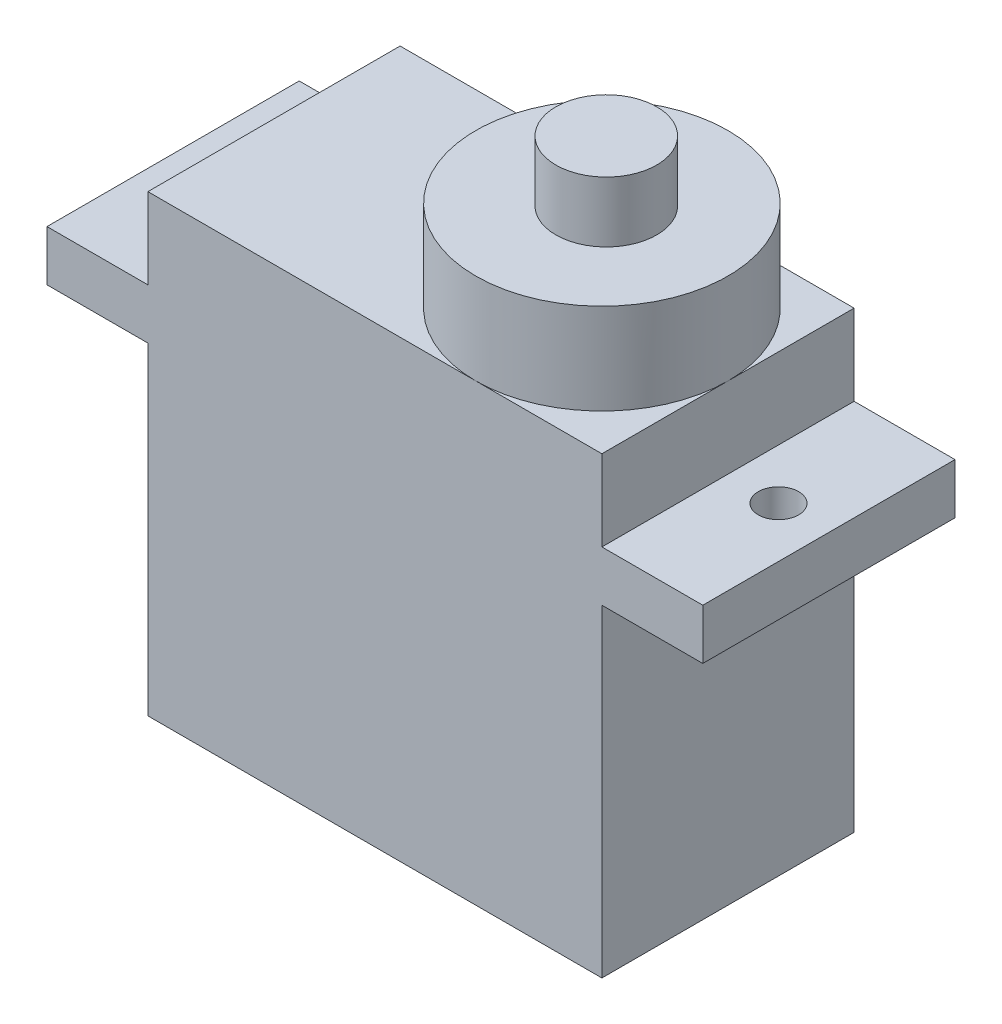
ISO-10303-21;
HEADER;
FILE_DESCRIPTION(('STEP AP214'),'2;1');
FILE_NAME('part.step','',(''),(''),'','','');
FILE_SCHEMA(('AUTOMOTIVE_DESIGN { 1 0 10303 214 1 1 1 1 }'));
ENDSEC;
DATA;
#1=APPLICATION_CONTEXT('core data for automotive mechanical design processes');
#2=APPLICATION_PROTOCOL_DEFINITION('international standard','automotive_design',2000,#1);
#3=PRODUCT_CONTEXT('',#1,'mechanical');
#4=PRODUCT('Part','Part','',(#3));
#5=PRODUCT_RELATED_PRODUCT_CATEGORY('part','',(#4));
#6=PRODUCT_DEFINITION_FORMATION('','',#4);
#7=PRODUCT_DEFINITION_CONTEXT('part definition',#1,'design');
#8=PRODUCT_DEFINITION('design','',#6,#7);
#9=PRODUCT_DEFINITION_SHAPE('','',#8);
#10=(LENGTH_UNIT() NAMED_UNIT(*) SI_UNIT(.MILLI.,.METRE.));
#11=(NAMED_UNIT(*) PLANE_ANGLE_UNIT() SI_UNIT($,.RADIAN.));
#12=(NAMED_UNIT(*) SI_UNIT($,.STERADIAN.) SOLID_ANGLE_UNIT());
#13=UNCERTAINTY_MEASURE_WITH_UNIT(LENGTH_MEASURE(1.E-05),#10,'distance_accuracy_value','');
#14=(GEOMETRIC_REPRESENTATION_CONTEXT(3) GLOBAL_UNCERTAINTY_ASSIGNED_CONTEXT((#13)) GLOBAL_UNIT_ASSIGNED_CONTEXT((#10,
#11,#12)) REPRESENTATION_CONTEXT('',''));
#15=CARTESIAN_POINT('',(0.,0.,0.));
#16=DIRECTION('',(0.,0.,1.));
#17=DIRECTION('',(1.,0.,0.));
#18=AXIS2_PLACEMENT_3D('',#15,#16,#17);
#19=CARTESIAN_POINT('',(0.,22.5,0.));
#20=DIRECTION('',(0.,1.,0.));
#21=DIRECTION('',(0.,0.,1.));
#22=AXIS2_PLACEMENT_3D('',#19,#20,#21);
#23=PLANE('',#22);
#24=CARTESIAN_POINT('',(5.,22.5,0.));
#25=DIRECTION('',(0.,1.,0.));
#26=DIRECTION('',(0.,0.,1.));
#27=AXIS2_PLACEMENT_3D('',#24,#25,#26);
#28=CIRCLE('',#27,6.25);
#29=CARTESIAN_POINT('',(5.,22.5,6.25));
#30=VERTEX_POINT('',#29);
#31=CARTESIAN_POINT('',(11.25,22.5,0.));
#32=VERTEX_POINT('',#31);
#33=EDGE_CURVE('E159',#30,#32,#28,.T.);
#34=ORIENTED_EDGE('',*,*,#33,.F.);
#35=DIRECTION('',(1.,0.,0.));
#36=VECTOR('',#35,1.);
#37=CARTESIAN_POINT('',(-11.25,22.5,6.25));
#38=LINE('',#37,#36);
#39=CARTESIAN_POINT('',(11.25,22.5,6.25));
#40=VERTEX_POINT('',#39);
#41=EDGE_CURVE('E146',#30,#40,#38,.T.);
#42=ORIENTED_EDGE('',*,*,#41,.T.);
#43=DIRECTION('',(0.,0.,-1.));
#44=VECTOR('',#43,1.);
#45=CARTESIAN_POINT('',(11.25,22.5,-6.25));
#46=LINE('',#45,#44);
#47=EDGE_CURVE('E160',#40,#32,#46,.T.);
#48=ORIENTED_EDGE('',*,*,#47,.T.);
#49=EDGE_LOOP('',(#34,#42,#48));
#50=FACE_BOUND('',#49,.T.);
#51=ADVANCED_FACE('F39',(#50),#23,.T.);
#52=CARTESIAN_POINT('',(5.,22.5,-6.25));
#53=VERTEX_POINT('',#52);
#54=EDGE_CURVE('E48',#32,#53,#28,.T.);
#55=ORIENTED_EDGE('',*,*,#54,.F.);
#56=CARTESIAN_POINT('',(11.25,22.5,-6.25));
#57=VERTEX_POINT('',#56);
#58=EDGE_CURVE('E236',#32,#57,#46,.T.);
#59=ORIENTED_EDGE('',*,*,#58,.T.);
#60=DIRECTION('',(-1.,0.,0.));
#61=VECTOR('',#60,1.);
#62=CARTESIAN_POINT('',(-11.25,22.5,-6.25));
#63=LINE('',#62,#61);
#64=EDGE_CURVE('E237',#57,#53,#63,.T.);
#65=ORIENTED_EDGE('',*,*,#64,.T.);
#66=EDGE_LOOP('',(#55,#59,#65));
#67=FACE_BOUND('',#66,.T.);
#68=ADVANCED_FACE('F296',(#67),#23,.T.);
#69=CARTESIAN_POINT('',(-11.25,22.5,-6.25));
#70=DIRECTION('',(1.,0.,0.));
#71=DIRECTION('',(0.,0.,-1.));
#72=AXIS2_PLACEMENT_3D('',#69,#70,#71);
#73=PLANE('',#72);
#74=DIRECTION('',(0.,0.,1.));
#75=VECTOR('',#74,1.);
#76=CARTESIAN_POINT('',(-11.25,16.,-6.25));
#77=LINE('',#76,#75);
#78=CARTESIAN_POINT('',(-11.25,16.,-6.25));
#79=VERTEX_POINT('',#78);
#80=CARTESIAN_POINT('',(-11.25,16.,6.25));
#81=VERTEX_POINT('',#80);
#82=EDGE_CURVE('E173',#79,#81,#77,.T.);
#83=ORIENTED_EDGE('',*,*,#82,.F.);
#84=DIRECTION('',(0.,-1.,0.));
#85=VECTOR('',#84,1.);
#86=CARTESIAN_POINT('',(-11.25,22.5,-6.25));
#87=LINE('',#86,#85);
#88=CARTESIAN_POINT('',(-11.25,0.,-6.25));
#89=VERTEX_POINT('',#88);
#90=EDGE_CURVE('E253',#79,#89,#87,.T.);
#91=ORIENTED_EDGE('',*,*,#90,.T.);
#92=DIRECTION('',(0.,0.,1.));
#93=VECTOR('',#92,1.);
#94=CARTESIAN_POINT('',(-11.25,0.,-6.25));
#95=LINE('',#94,#93);
#96=CARTESIAN_POINT('',(-11.25,0.,6.25));
#97=VERTEX_POINT('',#96);
#98=EDGE_CURVE('E245',#89,#97,#95,.T.);
#99=ORIENTED_EDGE('',*,*,#98,.T.);
#100=DIRECTION('',(0.,-1.,0.));
#101=VECTOR('',#100,1.);
#102=CARTESIAN_POINT('',(-11.25,22.5,6.25));
#103=LINE('',#102,#101);
#104=EDGE_CURVE('E251',#81,#97,#103,.T.);
#105=ORIENTED_EDGE('',*,*,#104,.F.);
#106=EDGE_LOOP('',(#83,#91,#99,#105));
#107=FACE_BOUND('',#106,.T.);
#108=ADVANCED_FACE('F261',(#107),#73,.F.);
#109=CARTESIAN_POINT('',(11.25,22.5,-6.25));
#110=DIRECTION('',(-1.,0.,0.));
#111=DIRECTION('',(0.,0.,1.));
#112=AXIS2_PLACEMENT_3D('',#109,#110,#111);
#113=PLANE('',#112);
#114=DIRECTION('',(0.,0.,1.));
#115=VECTOR('',#114,1.);
#116=CARTESIAN_POINT('',(11.25,18.5,-6.25));
#117=LINE('',#116,#115);
#118=CARTESIAN_POINT('',(11.25,18.5,-6.25));
#119=VERTEX_POINT('',#118);
#120=CARTESIAN_POINT('',(11.25,18.5,6.25));
#121=VERTEX_POINT('',#120);
#122=EDGE_CURVE('E225',#119,#121,#117,.T.);
#123=ORIENTED_EDGE('',*,*,#122,.F.);
#124=DIRECTION('',(0.,-1.,0.));
#125=VECTOR('',#124,1.);
#126=CARTESIAN_POINT('',(11.25,22.5,-6.25));
#127=LINE('',#126,#125);
#128=EDGE_CURVE('E43',#57,#119,#127,.T.);
#129=ORIENTED_EDGE('',*,*,#128,.F.);
#130=ORIENTED_EDGE('',*,*,#58,.F.);
#131=ORIENTED_EDGE('',*,*,#47,.F.);
#132=DIRECTION('',(0.,-1.,0.));
#133=VECTOR('',#132,1.);
#134=CARTESIAN_POINT('',(11.25,22.5,6.25));
#135=LINE('',#134,#133);
#136=EDGE_CURVE('E154',#40,#121,#135,.T.);
#137=ORIENTED_EDGE('',*,*,#136,.T.);
#138=EDGE_LOOP('',(#123,#129,#130,#131,#137));
#139=FACE_BOUND('',#138,.T.);
#140=ADVANCED_FACE('F295',(#139),#113,.F.);
#141=CARTESIAN_POINT('',(11.25,16.,-6.25));
#142=VERTEX_POINT('',#141);
#143=CARTESIAN_POINT('',(11.25,0.,-6.25));
#144=VERTEX_POINT('',#143);
#145=EDGE_CURVE('E167',#142,#144,#127,.T.);
#146=ORIENTED_EDGE('',*,*,#145,.F.);
#147=DIRECTION('',(0.,0.,1.));
#148=VECTOR('',#147,1.);
#149=CARTESIAN_POINT('',(11.25,16.,-6.25));
#150=LINE('',#149,#148);
#151=CARTESIAN_POINT('',(11.25,16.,6.25));
#152=VERTEX_POINT('',#151);
#153=EDGE_CURVE('E218',#142,#152,#150,.T.);
#154=ORIENTED_EDGE('',*,*,#153,.T.);
#155=CARTESIAN_POINT('',(11.25,0.,6.25));
#156=VERTEX_POINT('',#155);
#157=EDGE_CURVE('E145',#152,#156,#135,.T.);
#158=ORIENTED_EDGE('',*,*,#157,.T.);
#159=DIRECTION('',(0.,0.,-1.));
#160=VECTOR('',#159,1.);
#161=CARTESIAN_POINT('',(11.25,0.,-6.25));
#162=LINE('',#161,#160);
#163=EDGE_CURVE('E227',#156,#144,#162,.T.);
#164=ORIENTED_EDGE('',*,*,#163,.T.);
#165=EDGE_LOOP('',(#146,#154,#158,#164));
#166=FACE_BOUND('',#165,.T.);
#167=ADVANCED_FACE('F41',(#166),#113,.F.);
#168=CARTESIAN_POINT('',(-11.25,22.5,-6.25));
#169=DIRECTION('',(0.,0.,1.));
#170=DIRECTION('',(1.,0.,0.));
#171=AXIS2_PLACEMENT_3D('',#168,#169,#170);
#172=PLANE('',#171);
#173=DIRECTION('',(-1.,0.,0.));
#174=VECTOR('',#173,1.);
#175=CARTESIAN_POINT('',(-11.25,0.,-6.25));
#176=LINE('',#175,#174);
#177=EDGE_CURVE('E242',#144,#89,#176,.T.);
#178=ORIENTED_EDGE('',*,*,#177,.T.);
#179=ORIENTED_EDGE('',*,*,#90,.F.);
#180=DIRECTION('',(1.,0.,0.));
#181=VECTOR('',#180,1.);
#182=CARTESIAN_POINT('',(-11.25,16.,-6.25));
#183=LINE('',#182,#181);
#184=CARTESIAN_POINT('',(-16.25,16.,-6.25));
#185=VERTEX_POINT('',#184);
#186=EDGE_CURVE('E186',#185,#79,#183,.T.);
#187=ORIENTED_EDGE('',*,*,#186,.F.);
#188=DIRECTION('',(0.,-1.,0.));
#189=VECTOR('',#188,1.);
#190=CARTESIAN_POINT('',(-16.25,18.5,-6.25));
#191=LINE('',#190,#189);
#192=CARTESIAN_POINT('',(-16.25,18.5,-6.25));
#193=VERTEX_POINT('',#192);
#194=EDGE_CURVE('E204',#193,#185,#191,.T.);
#195=ORIENTED_EDGE('',*,*,#194,.F.);
#196=DIRECTION('',(-1.,0.,0.));
#197=VECTOR('',#196,1.);
#198=CARTESIAN_POINT('',(-11.25,18.5,-6.25));
#199=LINE('',#198,#197);
#200=CARTESIAN_POINT('',(-11.25,18.5,-6.25));
#201=VERTEX_POINT('',#200);
#202=EDGE_CURVE('E196',#201,#193,#199,.T.);
#203=ORIENTED_EDGE('',*,*,#202,.F.);
#204=CARTESIAN_POINT('',(-11.25,22.5,-6.25));
#205=VERTEX_POINT('',#204);
#206=EDGE_CURVE('E254',#205,#201,#87,.T.);
#207=ORIENTED_EDGE('',*,*,#206,.F.);
#208=EDGE_CURVE('E235',#53,#205,#63,.T.);
#209=ORIENTED_EDGE('',*,*,#208,.F.);
#210=ORIENTED_EDGE('',*,*,#64,.F.);
#211=ORIENTED_EDGE('',*,*,#128,.T.);
#212=DIRECTION('',(-1.,0.,0.));
#213=VECTOR('',#212,1.);
#214=CARTESIAN_POINT('',(11.25,18.5,-6.25));
#215=LINE('',#214,#213);
#216=CARTESIAN_POINT('',(16.25,18.5,-6.25));
#217=VERTEX_POINT('',#216);
#218=EDGE_CURVE('E216',#217,#119,#215,.T.);
#219=ORIENTED_EDGE('',*,*,#218,.F.);
#220=DIRECTION('',(0.,1.,0.));
#221=VECTOR('',#220,1.);
#222=CARTESIAN_POINT('',(16.25,18.5,-6.25));
#223=LINE('',#222,#221);
#224=CARTESIAN_POINT('',(16.25,16.,-6.25));
#225=VERTEX_POINT('',#224);
#226=EDGE_CURVE('E212',#225,#217,#223,.T.);
#227=ORIENTED_EDGE('',*,*,#226,.F.);
#228=DIRECTION('',(1.,0.,0.));
#229=VECTOR('',#228,1.);
#230=CARTESIAN_POINT('',(11.25,16.,-6.25));
#231=LINE('',#230,#229);
#232=EDGE_CURVE('E209',#142,#225,#231,.T.);
#233=ORIENTED_EDGE('',*,*,#232,.F.);
#234=ORIENTED_EDGE('',*,*,#145,.T.);
#235=EDGE_LOOP('',(#178,#179,#187,#195,#203,#207,#209,#210,#211,#219,#227,#233,#234));
#236=FACE_BOUND('',#235,.T.);
#237=ADVANCED_FACE('F268',(#236),#172,.F.);
#238=ORIENTED_EDGE('',*,*,#206,.T.);
#239=DIRECTION('',(0.,0.,1.));
#240=VECTOR('',#239,1.);
#241=CARTESIAN_POINT('',(-11.25,18.5,-6.25));
#242=LINE('',#241,#240);
#243=CARTESIAN_POINT('',(-11.25,18.5,6.25));
#244=VERTEX_POINT('',#243);
#245=EDGE_CURVE('E183',#201,#244,#242,.T.);
#246=ORIENTED_EDGE('',*,*,#245,.T.);
#247=CARTESIAN_POINT('',(-11.25,22.5,6.25));
#248=VERTEX_POINT('',#247);
#249=EDGE_CURVE('E252',#248,#244,#103,.T.);
#250=ORIENTED_EDGE('',*,*,#249,.F.);
#251=DIRECTION('',(0.,0.,1.));
#252=VECTOR('',#251,1.);
#253=CARTESIAN_POINT('',(-11.25,22.5,-6.25));
#254=LINE('',#253,#252);
#255=EDGE_CURVE('E141',#205,#248,#254,.T.);
#256=ORIENTED_EDGE('',*,*,#255,.F.);
#257=EDGE_LOOP('',(#238,#246,#250,#256));
#258=FACE_BOUND('',#257,.T.);
#259=ADVANCED_FACE('F284',(#258),#73,.F.);
#260=CARTESIAN_POINT('',(-11.25,22.5,6.25));
#261=DIRECTION('',(0.,0.,-1.));
#262=DIRECTION('',(-1.,0.,0.));
#263=AXIS2_PLACEMENT_3D('',#260,#261,#262);
#264=PLANE('',#263);
#265=DIRECTION('',(1.,0.,0.));
#266=VECTOR('',#265,1.);
#267=CARTESIAN_POINT('',(-11.25,0.,6.25));
#268=LINE('',#267,#266);
#269=EDGE_CURVE('E248',#97,#156,#268,.T.);
#270=ORIENTED_EDGE('',*,*,#269,.T.);
#271=ORIENTED_EDGE('',*,*,#157,.F.);
#272=DIRECTION('',(1.,0.,0.));
#273=VECTOR('',#272,1.);
#274=CARTESIAN_POINT('',(11.25,16.,6.25));
#275=LINE('',#274,#273);
#276=CARTESIAN_POINT('',(16.25,16.,6.25));
#277=VERTEX_POINT('',#276);
#278=EDGE_CURVE('E202',#152,#277,#275,.T.);
#279=ORIENTED_EDGE('',*,*,#278,.T.);
#280=DIRECTION('',(0.,1.,0.));
#281=VECTOR('',#280,1.);
#282=CARTESIAN_POINT('',(16.25,18.5,6.25));
#283=LINE('',#282,#281);
#284=CARTESIAN_POINT('',(16.25,18.5,6.25));
#285=VERTEX_POINT('',#284);
#286=EDGE_CURVE('E221',#277,#285,#283,.T.);
#287=ORIENTED_EDGE('',*,*,#286,.T.);
#288=DIRECTION('',(-1.,0.,0.));
#289=VECTOR('',#288,1.);
#290=CARTESIAN_POINT('',(11.25,18.5,6.25));
#291=LINE('',#290,#289);
#292=EDGE_CURVE('E213',#285,#121,#291,.T.);
#293=ORIENTED_EDGE('',*,*,#292,.T.);
#294=ORIENTED_EDGE('',*,*,#136,.F.);
#295=ORIENTED_EDGE('',*,*,#41,.F.);
#296=EDGE_CURVE('E137',#248,#30,#38,.T.);
#297=ORIENTED_EDGE('',*,*,#296,.F.);
#298=ORIENTED_EDGE('',*,*,#249,.T.);
#299=DIRECTION('',(-1.,0.,0.));
#300=VECTOR('',#299,1.);
#301=CARTESIAN_POINT('',(-11.25,18.5,6.25));
#302=LINE('',#301,#300);
#303=CARTESIAN_POINT('',(-16.25,18.5,6.25));
#304=VERTEX_POINT('',#303);
#305=EDGE_CURVE('E199',#244,#304,#302,.T.);
#306=ORIENTED_EDGE('',*,*,#305,.T.);
#307=DIRECTION('',(0.,-1.,0.));
#308=VECTOR('',#307,1.);
#309=CARTESIAN_POINT('',(-16.25,18.5,6.25));
#310=LINE('',#309,#308);
#311=CARTESIAN_POINT('',(-16.25,16.,6.25));
#312=VERTEX_POINT('',#311);
#313=EDGE_CURVE('E195',#304,#312,#310,.T.);
#314=ORIENTED_EDGE('',*,*,#313,.T.);
#315=DIRECTION('',(1.,0.,0.));
#316=VECTOR('',#315,1.);
#317=CARTESIAN_POINT('',(-11.25,16.,6.25));
#318=LINE('',#317,#316);
#319=EDGE_CURVE('E192',#312,#81,#318,.T.);
#320=ORIENTED_EDGE('',*,*,#319,.T.);
#321=ORIENTED_EDGE('',*,*,#104,.T.);
#322=EDGE_LOOP('',(#270,#271,#279,#287,#293,#294,#295,#297,#298,#306,#314,#320,#321));
#323=FACE_BOUND('',#322,.T.);
#324=ADVANCED_FACE('F151',(#323),#264,.F.);
#325=EDGE_CURVE('E56',#53,#30,#28,.T.);
#326=ORIENTED_EDGE('',*,*,#325,.F.);
#327=ORIENTED_EDGE('',*,*,#208,.T.);
#328=ORIENTED_EDGE('',*,*,#255,.T.);
#329=ORIENTED_EDGE('',*,*,#296,.T.);
#330=EDGE_LOOP('',(#326,#327,#328,#329));
#331=FACE_BOUND('',#330,.T.);
#332=ADVANCED_FACE('F139',(#331),#23,.T.);
#333=CARTESIAN_POINT('',(0.,0.,0.));
#334=DIRECTION('',(0.,1.,0.));
#335=DIRECTION('',(0.,0.,1.));
#336=AXIS2_PLACEMENT_3D('',#333,#334,#335);
#337=PLANE('',#336);
#338=ORIENTED_EDGE('',*,*,#163,.F.);
#339=ORIENTED_EDGE('',*,*,#269,.F.);
#340=ORIENTED_EDGE('',*,*,#98,.F.);
#341=ORIENTED_EDGE('',*,*,#177,.F.);
#342=EDGE_LOOP('',(#338,#339,#340,#341));
#343=FACE_BOUND('',#342,.T.);
#344=ADVANCED_FACE('F273',(#343),#337,.F.);
#345=CARTESIAN_POINT('',(11.25,18.5,-6.25));
#346=DIRECTION('',(0.,1.,0.));
#347=DIRECTION('',(0.,0.,1.));
#348=AXIS2_PLACEMENT_3D('',#345,#346,#347);
#349=PLANE('',#348);
#350=CARTESIAN_POINT('',(13.75,18.5,0.));
#351=DIRECTION('',(0.,1.,0.));
#352=DIRECTION('',(0.,0.,1.));
#353=AXIS2_PLACEMENT_3D('',#350,#351,#352);
#354=CIRCLE('',#353,1.);
#355=CARTESIAN_POINT('',(13.75,18.5,1.));
#356=VERTEX_POINT('',#355);
#357=EDGE_CURVE('E170',#356,#356,#354,.T.);
#358=ORIENTED_EDGE('',*,*,#357,.F.);
#359=EDGE_LOOP('',(#358));
#360=FACE_BOUND('',#359,.T.);
#361=ORIENTED_EDGE('',*,*,#292,.F.);
#362=DIRECTION('',(0.,0.,1.));
#363=VECTOR('',#362,1.);
#364=CARTESIAN_POINT('',(16.25,18.5,-6.25));
#365=LINE('',#364,#363);
#366=EDGE_CURVE('E228',#217,#285,#365,.T.);
#367=ORIENTED_EDGE('',*,*,#366,.F.);
#368=ORIENTED_EDGE('',*,*,#218,.T.);
#369=ORIENTED_EDGE('',*,*,#122,.T.);
#370=EDGE_LOOP('',(#361,#367,#368,#369));
#371=FACE_BOUND('',#370,.T.);
#372=ADVANCED_FACE('F310',(#360,#371),#349,.T.);
#373=CARTESIAN_POINT('',(16.25,18.5,-6.25));
#374=DIRECTION('',(1.,0.,0.));
#375=DIRECTION('',(0.,0.,-1.));
#376=AXIS2_PLACEMENT_3D('',#373,#374,#375);
#377=PLANE('',#376);
#378=ORIENTED_EDGE('',*,*,#286,.F.);
#379=DIRECTION('',(0.,0.,1.));
#380=VECTOR('',#379,1.);
#381=CARTESIAN_POINT('',(16.25,16.,-6.25));
#382=LINE('',#381,#380);
#383=EDGE_CURVE('E230',#225,#277,#382,.T.);
#384=ORIENTED_EDGE('',*,*,#383,.F.);
#385=ORIENTED_EDGE('',*,*,#226,.T.);
#386=ORIENTED_EDGE('',*,*,#366,.T.);
#387=EDGE_LOOP('',(#378,#384,#385,#386));
#388=FACE_BOUND('',#387,.T.);
#389=ADVANCED_FACE('F314',(#388),#377,.T.);
#390=CARTESIAN_POINT('',(11.25,16.,-6.25));
#391=DIRECTION('',(0.,-1.,0.));
#392=DIRECTION('',(0.,0.,-1.));
#393=AXIS2_PLACEMENT_3D('',#390,#391,#392);
#394=PLANE('',#393);
#395=CARTESIAN_POINT('',(13.75,16.,0.));
#396=DIRECTION('',(0.,-1.,0.));
#397=DIRECTION('',(0.,0.,-1.));
#398=AXIS2_PLACEMENT_3D('',#395,#396,#397);
#399=CIRCLE('',#398,1.);
#400=CARTESIAN_POINT('',(13.75,16.,-1.));
#401=VERTEX_POINT('',#400);
#402=EDGE_CURVE('E174',#401,#401,#399,.F.);
#403=ORIENTED_EDGE('',*,*,#402,.T.);
#404=EDGE_LOOP('',(#403));
#405=FACE_BOUND('',#404,.T.);
#406=ORIENTED_EDGE('',*,*,#278,.F.);
#407=ORIENTED_EDGE('',*,*,#153,.F.);
#408=ORIENTED_EDGE('',*,*,#232,.T.);
#409=ORIENTED_EDGE('',*,*,#383,.T.);
#410=EDGE_LOOP('',(#406,#407,#408,#409));
#411=FACE_BOUND('',#410,.T.);
#412=ADVANCED_FACE('F321',(#405,#411),#394,.T.);
#413=CARTESIAN_POINT('',(-11.25,16.,-6.25));
#414=DIRECTION('',(0.,-1.,0.));
#415=DIRECTION('',(0.,0.,-1.));
#416=AXIS2_PLACEMENT_3D('',#413,#414,#415);
#417=PLANE('',#416);
#418=CARTESIAN_POINT('',(-13.75,16.,0.));
#419=DIRECTION('',(0.,-1.,0.));
#420=DIRECTION('',(0.,0.,-1.));
#421=AXIS2_PLACEMENT_3D('',#418,#419,#420);
#422=CIRCLE('',#421,1.);
#423=CARTESIAN_POINT('',(-13.75,16.,-1.));
#424=VERTEX_POINT('',#423);
#425=EDGE_CURVE('E177',#424,#424,#422,.F.);
#426=ORIENTED_EDGE('',*,*,#425,.T.);
#427=EDGE_LOOP('',(#426));
#428=FACE_BOUND('',#427,.T.);
#429=ORIENTED_EDGE('',*,*,#319,.F.);
#430=DIRECTION('',(0.,0.,1.));
#431=VECTOR('',#430,1.);
#432=CARTESIAN_POINT('',(-16.25,16.,-6.25));
#433=LINE('',#432,#431);
#434=EDGE_CURVE('E189',#185,#312,#433,.T.);
#435=ORIENTED_EDGE('',*,*,#434,.F.);
#436=ORIENTED_EDGE('',*,*,#186,.T.);
#437=ORIENTED_EDGE('',*,*,#82,.T.);
#438=EDGE_LOOP('',(#429,#435,#436,#437));
#439=FACE_BOUND('',#438,.T.);
#440=ADVANCED_FACE('F278',(#428,#439),#417,.T.);
#441=CARTESIAN_POINT('',(-16.25,18.5,-6.25));
#442=DIRECTION('',(-1.,0.,0.));
#443=DIRECTION('',(0.,0.,1.));
#444=AXIS2_PLACEMENT_3D('',#441,#442,#443);
#445=PLANE('',#444);
#446=ORIENTED_EDGE('',*,*,#313,.F.);
#447=DIRECTION('',(0.,0.,1.));
#448=VECTOR('',#447,1.);
#449=CARTESIAN_POINT('',(-16.25,18.5,-6.25));
#450=LINE('',#449,#448);
#451=EDGE_CURVE('E187',#193,#304,#450,.T.);
#452=ORIENTED_EDGE('',*,*,#451,.F.);
#453=ORIENTED_EDGE('',*,*,#194,.T.);
#454=ORIENTED_EDGE('',*,*,#434,.T.);
#455=EDGE_LOOP('',(#446,#452,#453,#454));
#456=FACE_BOUND('',#455,.T.);
#457=ADVANCED_FACE('F332',(#456),#445,.T.);
#458=CARTESIAN_POINT('',(-11.25,18.5,-6.25));
#459=DIRECTION('',(0.,1.,0.));
#460=DIRECTION('',(0.,0.,1.));
#461=AXIS2_PLACEMENT_3D('',#458,#459,#460);
#462=PLANE('',#461);
#463=CARTESIAN_POINT('',(-13.75,18.5,0.));
#464=DIRECTION('',(0.,1.,0.));
#465=DIRECTION('',(0.,0.,1.));
#466=AXIS2_PLACEMENT_3D('',#463,#464,#465);
#467=CIRCLE('',#466,1.);
#468=CARTESIAN_POINT('',(-13.75,18.5,1.));
#469=VERTEX_POINT('',#468);
#470=EDGE_CURVE('E180',#469,#469,#467,.T.);
#471=ORIENTED_EDGE('',*,*,#470,.F.);
#472=EDGE_LOOP('',(#471));
#473=FACE_BOUND('',#472,.T.);
#474=ORIENTED_EDGE('',*,*,#305,.F.);
#475=ORIENTED_EDGE('',*,*,#245,.F.);
#476=ORIENTED_EDGE('',*,*,#202,.T.);
#477=ORIENTED_EDGE('',*,*,#451,.T.);
#478=EDGE_LOOP('',(#474,#475,#476,#477));
#479=FACE_BOUND('',#478,.T.);
#480=ADVANCED_FACE('F283',(#473,#479),#462,.T.);
#481=CARTESIAN_POINT('',(-13.75,-0.001000000000001,0.));
#482=DIRECTION('',(0.,1.,0.));
#483=DIRECTION('',(0.,0.,1.));
#484=AXIS2_PLACEMENT_3D('',#481,#482,#483);
#485=CYLINDRICAL_SURFACE('',#484,1.);
#486=ORIENTED_EDGE('',*,*,#425,.F.);
#487=EDGE_LOOP('',(#486));
#488=FACE_BOUND('',#487,.T.);
#489=ORIENTED_EDGE('',*,*,#470,.T.);
#490=EDGE_LOOP('',(#489));
#491=FACE_BOUND('',#490,.T.);
#492=ADVANCED_FACE('F402',(#488,#491),#485,.F.);
#493=CARTESIAN_POINT('',(13.75,-0.001000000000001,0.));
#494=DIRECTION('',(0.,1.,0.));
#495=DIRECTION('',(0.,0.,1.));
#496=AXIS2_PLACEMENT_3D('',#493,#494,#495);
#497=CYLINDRICAL_SURFACE('',#496,1.);
#498=ORIENTED_EDGE('',*,*,#402,.F.);
#499=EDGE_LOOP('',(#498));
#500=FACE_BOUND('',#499,.T.);
#501=ORIENTED_EDGE('',*,*,#357,.T.);
#502=EDGE_LOOP('',(#501));
#503=FACE_BOUND('',#502,.T.);
#504=ADVANCED_FACE('F412',(#500,#503),#497,.F.);
#505=CARTESIAN_POINT('',(5.,27.,0.));
#506=DIRECTION('',(0.,-1.,0.));
#507=DIRECTION('',(0.,0.,-1.));
#508=AXIS2_PLACEMENT_3D('',#505,#506,#507);
#509=CYLINDRICAL_SURFACE('',#508,6.25);
#510=CARTESIAN_POINT('',(5.,27.,0.));
#511=DIRECTION('',(0.,1.,0.));
#512=DIRECTION('',(0.,0.,1.));
#513=AXIS2_PLACEMENT_3D('',#510,#511,#512);
#514=CIRCLE('',#513,6.25);
#515=CARTESIAN_POINT('',(5.,27.,6.25));
#516=VERTEX_POINT('',#515);
#517=EDGE_CURVE('E162',#516,#516,#514,.T.);
#518=ORIENTED_EDGE('',*,*,#517,.F.);
#519=EDGE_LOOP('',(#518));
#520=FACE_BOUND('',#519,.T.);
#521=ORIENTED_EDGE('',*,*,#33,.T.);
#522=ORIENTED_EDGE('',*,*,#54,.T.);
#523=ORIENTED_EDGE('',*,*,#325,.T.);
#524=EDGE_LOOP('',(#521,#522,#523));
#525=FACE_BOUND('',#524,.T.);
#526=ADVANCED_FACE('F165',(#520,#525),#509,.T.);
#527=CARTESIAN_POINT('',(5.,27.,0.));
#528=DIRECTION('',(0.,1.,0.));
#529=DIRECTION('',(0.,0.,1.));
#530=AXIS2_PLACEMENT_3D('',#527,#528,#529);
#531=PLANE('',#530);
#532=CARTESIAN_POINT('',(5.21837814719962,27.,0.));
#533=DIRECTION('',(0.,1.,0.));
#534=DIRECTION('',(0.,0.,1.));
#535=AXIS2_PLACEMENT_3D('',#532,#533,#534);
#536=CIRCLE('',#535,2.5);
#537=CARTESIAN_POINT('',(5.21837814719962,27.,2.5));
#538=VERTEX_POINT('',#537);
#539=EDGE_CURVE('E11',#538,#538,#536,.T.);
#540=ORIENTED_EDGE('',*,*,#539,.F.);
#541=EDGE_LOOP('',(#540));
#542=FACE_BOUND('',#541,.T.);
#543=ORIENTED_EDGE('',*,*,#517,.T.);
#544=EDGE_LOOP('',(#543));
#545=FACE_BOUND('',#544,.T.);
#546=ADVANCED_FACE('F437',(#542,#545),#531,.T.);
#547=CARTESIAN_POINT('',(5.21837814719962,30.,0.));
#548=DIRECTION('',(0.,-1.,0.));
#549=DIRECTION('',(0.,0.,-1.));
#550=AXIS2_PLACEMENT_3D('',#547,#548,#549);
#551=CYLINDRICAL_SURFACE('',#550,2.5);
#552=CARTESIAN_POINT('',(5.21837814719962,30.,0.));
#553=DIRECTION('',(0.,1.,0.));
#554=DIRECTION('',(0.,0.,1.));
#555=AXIS2_PLACEMENT_3D('',#552,#553,#554);
#556=CIRCLE('',#555,2.5);
#557=CARTESIAN_POINT('',(5.21837814719962,30.,2.5));
#558=VERTEX_POINT('',#557);
#559=EDGE_CURVE('E163',#558,#558,#556,.T.);
#560=ORIENTED_EDGE('',*,*,#559,.F.);
#561=EDGE_LOOP('',(#560));
#562=FACE_BOUND('',#561,.T.);
#563=ORIENTED_EDGE('',*,*,#539,.T.);
#564=EDGE_LOOP('',(#563));
#565=FACE_BOUND('',#564,.T.);
#566=ADVANCED_FACE('F447',(#562,#565),#551,.T.);
#567=CARTESIAN_POINT('',(5.21837814719962,30.,0.));
#568=DIRECTION('',(0.,1.,0.));
#569=DIRECTION('',(0.,0.,1.));
#570=AXIS2_PLACEMENT_3D('',#567,#568,#569);
#571=PLANE('',#570);
#572=ORIENTED_EDGE('',*,*,#559,.T.);
#573=EDGE_LOOP('',(#572));
#574=FACE_BOUND('',#573,.T.);
#575=ADVANCED_FACE('F457',(#574),#571,.T.);
#576=CLOSED_SHELL('',(#51,#68,#108,#140,#167,#237,#259,#324,#332,#344,#372,#389,#412,#440,#457,
#480,#492,#504,#526,#546,#566,#575));
#577=MANIFOLD_SOLID_BREP('B2',#576);
#578=ADVANCED_BREP_SHAPE_REPRESENTATION('',(#18,#577),#14);
#579=SHAPE_DEFINITION_REPRESENTATION(#9,#578);
ENDSEC;
END-ISO-10303-21;
